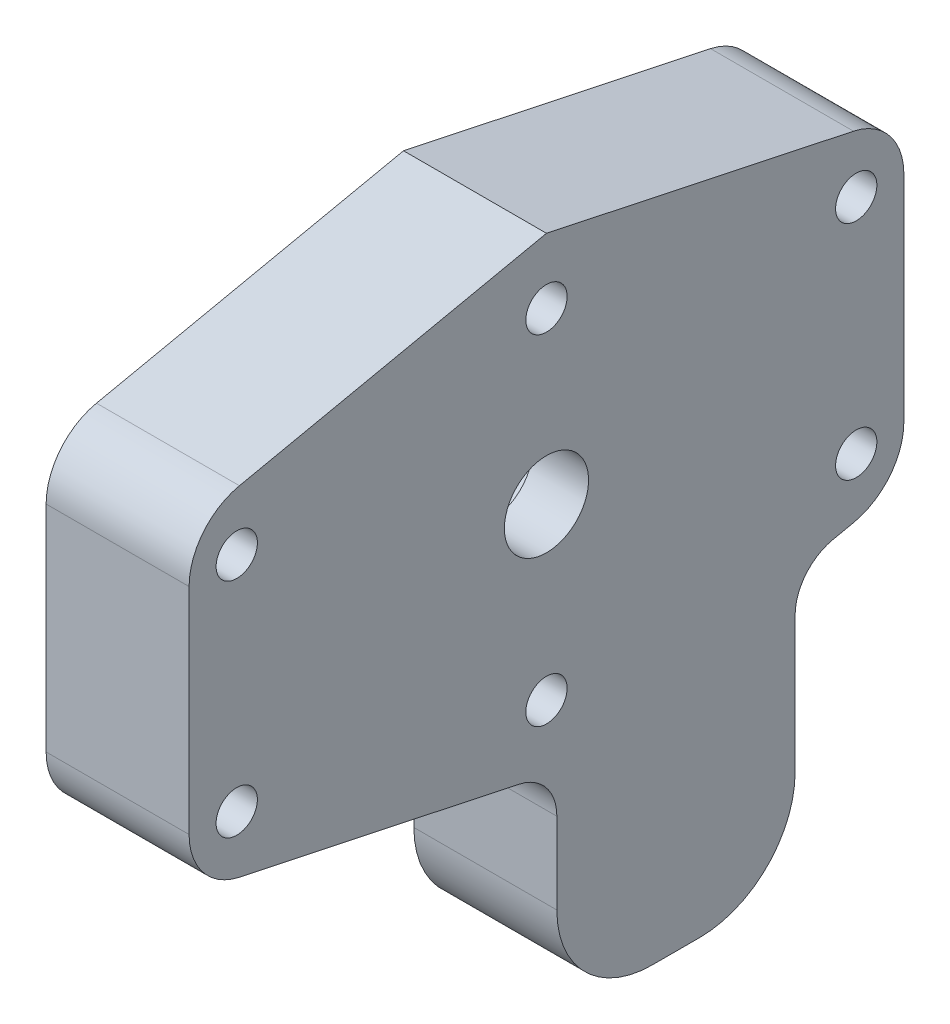
ISO-10303-21;
HEADER;
FILE_DESCRIPTION(('STEP AP214'),'2;1');
FILE_NAME('part.step','',(''),(''),'','','');
FILE_SCHEMA(('AUTOMOTIVE_DESIGN { 1 0 10303 214 1 1 1 1 }'));
ENDSEC;
DATA;
#1=APPLICATION_CONTEXT('core data for automotive mechanical design processes');
#2=APPLICATION_PROTOCOL_DEFINITION('international standard','automotive_design',2000,#1);
#3=PRODUCT_CONTEXT('',#1,'mechanical');
#4=PRODUCT('Part','Part','',(#3));
#5=PRODUCT_RELATED_PRODUCT_CATEGORY('part','',(#4));
#6=PRODUCT_DEFINITION_FORMATION('','',#4);
#7=PRODUCT_DEFINITION_CONTEXT('part definition',#1,'design');
#8=PRODUCT_DEFINITION('design','',#6,#7);
#9=PRODUCT_DEFINITION_SHAPE('','',#8);
#10=(LENGTH_UNIT() NAMED_UNIT(*) SI_UNIT(.MILLI.,.METRE.));
#11=(NAMED_UNIT(*) PLANE_ANGLE_UNIT() SI_UNIT($,.RADIAN.));
#12=(NAMED_UNIT(*) SI_UNIT($,.STERADIAN.) SOLID_ANGLE_UNIT());
#13=UNCERTAINTY_MEASURE_WITH_UNIT(LENGTH_MEASURE(1.E-05),#10,'distance_accuracy_value','');
#14=(GEOMETRIC_REPRESENTATION_CONTEXT(3) GLOBAL_UNCERTAINTY_ASSIGNED_CONTEXT((#13)) GLOBAL_UNIT_ASSIGNED_CONTEXT((#10,
#11,#12)) REPRESENTATION_CONTEXT('',''));
#15=CARTESIAN_POINT('',(0.,0.,0.));
#16=DIRECTION('',(0.,0.,1.));
#17=DIRECTION('',(1.,0.,0.));
#18=AXIS2_PLACEMENT_3D('',#15,#16,#17);
#19=CARTESIAN_POINT('',(9.,-28.2690306373786,-5.99265255801159));
#20=DIRECTION('',(0.,0.978260869565217,0.207378087264553));
#21=DIRECTION('',(0.,-0.207378087264554,0.978260869565218));
#22=AXIS2_PLACEMENT_3D('',#19,#20,#21);
#23=PLANE('',#22);
#24=DIRECTION('',(0.,0.207378087264554,-0.978260869565218));
#25=VECTOR('',#24,1.);
#26=CARTESIAN_POINT('',(9.,-28.2690306373786,-5.99265255801159));
#27=LINE('',#26,#25);
#28=CARTESIAN_POINT('',(9.,-20.9475712012116,-40.5300396512498));
#29=VERTEX_POINT('',#28);
#30=CARTESIAN_POINT('',(9.,-20.672100546187,-41.8295123490582));
#31=VERTEX_POINT('',#30);
#32=EDGE_CURVE('E195',#29,#31,#27,.T.);
#33=ORIENTED_EDGE('',*,*,#32,.F.);
#34=DIRECTION('',(1.,0.,0.));
#35=VECTOR('',#34,1.);
#36=CARTESIAN_POINT('',(9.,-20.9475712012116,-40.5300396512498));
#37=LINE('',#36,#35);
#38=CARTESIAN_POINT('',(0.,-20.9475712012116,-40.5300396512498));
#39=VERTEX_POINT('',#38);
#40=EDGE_CURVE('E299',#29,#39,#37,.F.);
#41=ORIENTED_EDGE('',*,*,#40,.T.);
#42=DIRECTION('',(0.,0.207378087264554,-0.978260869565218));
#43=VECTOR('',#42,1.);
#44=CARTESIAN_POINT('',(0.,-28.2690306373786,-5.99265255801159));
#45=LINE('',#44,#43);
#46=CARTESIAN_POINT('',(0.,-20.672100546187,-41.8295123490582));
#47=VERTEX_POINT('',#46);
#48=EDGE_CURVE('E226',#39,#47,#45,.T.);
#49=ORIENTED_EDGE('',*,*,#48,.T.);
#50=DIRECTION('',(-1.,0.,0.));
#51=VECTOR('',#50,1.);
#52=CARTESIAN_POINT('',(9.,-20.672100546187,-41.8295123490582));
#53=LINE('',#52,#51);
#54=EDGE_CURVE('E275',#47,#31,#53,.F.);
#55=ORIENTED_EDGE('',*,*,#54,.T.);
#56=EDGE_LOOP('',(#33,#41,#49,#55));
#57=FACE_BOUND('',#56,.T.);
#58=ADVANCED_FACE('F35',(#57),#23,.F.);
#59=CARTESIAN_POINT('',(9.,0.,-45.));
#60=DIRECTION('',(0.,0.,-1.));
#61=DIRECTION('',(-1.,0.,0.));
#62=AXIS2_PLACEMENT_3D('',#59,#60,#61);
#63=PLANE('',#62);
#64=DIRECTION('',(0.,-1.,0.));
#65=VECTOR('',#64,1.);
#66=CARTESIAN_POINT('',(9.,0.,-45.));
#67=LINE('',#66,#65);
#68=CARTESIAN_POINT('',(9.,-3.24094293207383,-45.));
#69=VERTEX_POINT('',#68);
#70=CARTESIAN_POINT('',(9.,-16.7590570679262,-45.));
#71=VERTEX_POINT('',#70);
#72=EDGE_CURVE('E184',#69,#71,#67,.T.);
#73=ORIENTED_EDGE('',*,*,#72,.T.);
#74=DIRECTION('',(-1.,0.,0.));
#75=VECTOR('',#74,1.);
#76=CARTESIAN_POINT('',(0.,-16.7590570679262,-45.));
#77=LINE('',#76,#75);
#78=CARTESIAN_POINT('',(0.,-16.7590570679262,-45.));
#79=VERTEX_POINT('',#78);
#80=EDGE_CURVE('E263',#71,#79,#77,.T.);
#81=ORIENTED_EDGE('',*,*,#80,.T.);
#82=DIRECTION('',(0.,-1.,0.));
#83=VECTOR('',#82,1.);
#84=CARTESIAN_POINT('',(0.,0.,-45.));
#85=LINE('',#84,#83);
#86=CARTESIAN_POINT('',(0.,-3.24094293207383,-45.));
#87=VERTEX_POINT('',#86);
#88=EDGE_CURVE('E214',#87,#79,#85,.T.);
#89=ORIENTED_EDGE('',*,*,#88,.F.);
#90=DIRECTION('',(-1.,0.,0.));
#91=VECTOR('',#90,1.);
#92=CARTESIAN_POINT('',(9.,-3.24094293207383,-45.));
#93=LINE('',#92,#91);
#94=EDGE_CURVE('E261',#87,#69,#93,.F.);
#95=ORIENTED_EDGE('',*,*,#94,.T.);
#96=EDGE_LOOP('',(#73,#81,#89,#95));
#97=FACE_BOUND('',#96,.T.);
#98=ADVANCED_FACE('F374',(#97),#63,.T.);
#99=CARTESIAN_POINT('',(9.,9.12914405892871,-1.93525519848772));
#100=DIRECTION('',(0.,0.978260869565217,-0.207378087264554));
#101=DIRECTION('',(0.,0.207378087264554,0.978260869565218));
#102=AXIS2_PLACEMENT_3D('',#99,#100,#101);
#103=PLANE('',#102);
#104=DIRECTION('',(0.,-0.207378087264554,-0.978260869565218));
#105=VECTOR('',#104,1.);
#106=CARTESIAN_POINT('',(9.,9.12914405892871,-1.93525519848772));
#107=LINE('',#106,#105);
#108=CARTESIAN_POINT('',(9.,4.76969600708473,-22.5));
#109=VERTEX_POINT('',#108);
#110=CARTESIAN_POINT('',(9.,0.672100546187042,-41.8295123490582));
#111=VERTEX_POINT('',#110);
#112=EDGE_CURVE('E159',#109,#111,#107,.T.);
#113=ORIENTED_EDGE('',*,*,#112,.T.);
#114=DIRECTION('',(-1.,0.,0.));
#115=VECTOR('',#114,1.);
#116=CARTESIAN_POINT('',(9.,0.672100546187042,-41.8295123490582));
#117=LINE('',#116,#115);
#118=CARTESIAN_POINT('',(0.,0.672100546187042,-41.8295123490582));
#119=VERTEX_POINT('',#118);
#120=EDGE_CURVE('E285',#111,#119,#117,.T.);
#121=ORIENTED_EDGE('',*,*,#120,.T.);
#122=DIRECTION('',(0.,-0.207378087264554,-0.978260869565218));
#123=VECTOR('',#122,1.);
#124=CARTESIAN_POINT('',(0.,9.12914405892871,-1.93525519848772));
#125=LINE('',#124,#123);
#126=CARTESIAN_POINT('',(0.,4.76969600708473,-22.5));
#127=VERTEX_POINT('',#126);
#128=EDGE_CURVE('E162',#127,#119,#125,.T.);
#129=ORIENTED_EDGE('',*,*,#128,.F.);
#130=DIRECTION('',(-1.,0.,0.));
#131=VECTOR('',#130,1.);
#132=CARTESIAN_POINT('',(9.,4.76969600708473,-22.5));
#133=LINE('',#132,#131);
#134=EDGE_CURVE('E154',#109,#127,#133,.T.);
#135=ORIENTED_EDGE('',*,*,#134,.F.);
#136=EDGE_LOOP('',(#113,#121,#129,#135));
#137=FACE_BOUND('',#136,.T.);
#138=ADVANCED_FACE('F156',(#137),#103,.T.);
#139=CARTESIAN_POINT('',(9.,0.,0.));
#140=DIRECTION('',(0.,-0.978260869565217,-0.207378087264554));
#141=DIRECTION('',(0.,0.207378087264554,-0.978260869565218));
#142=AXIS2_PLACEMENT_3D('',#139,#140,#141);
#143=PLANE('',#142);
#144=DIRECTION('',(0.,-0.207378087264554,0.978260869565218));
#145=VECTOR('',#144,1.);
#146=CARTESIAN_POINT('',(0.,0.,0.));
#147=LINE('',#146,#145);
#148=CARTESIAN_POINT('',(0.,0.672100546187044,-3.17048765094179));
#149=VERTEX_POINT('',#148);
#150=EDGE_CURVE('E219',#127,#149,#147,.T.);
#151=ORIENTED_EDGE('',*,*,#150,.T.);
#152=DIRECTION('',(-1.,0.,0.));
#153=VECTOR('',#152,1.);
#154=CARTESIAN_POINT('',(9.,0.672100546187044,-3.17048765094179));
#155=LINE('',#154,#153);
#156=CARTESIAN_POINT('',(9.,0.672100546187044,-3.17048765094179));
#157=VERTEX_POINT('',#156);
#158=EDGE_CURVE('E173',#149,#157,#155,.F.);
#159=ORIENTED_EDGE('',*,*,#158,.T.);
#160=DIRECTION('',(0.,-0.207378087264554,0.978260869565218));
#161=VECTOR('',#160,1.);
#162=CARTESIAN_POINT('',(9.,0.,0.));
#163=LINE('',#162,#161);
#164=EDGE_CURVE('E170',#109,#157,#163,.T.);
#165=ORIENTED_EDGE('',*,*,#164,.F.);
#166=ORIENTED_EDGE('',*,*,#134,.T.);
#167=EDGE_LOOP('',(#151,#159,#165,#166));
#168=FACE_BOUND('',#167,.T.);
#169=ADVANCED_FACE('F171',(#168),#143,.F.);
#170=CARTESIAN_POINT('',(9.,0.,0.));
#171=DIRECTION('',(0.,0.,-1.));
#172=DIRECTION('',(0.,1.,0.));
#173=AXIS2_PLACEMENT_3D('',#170,#171,#172);
#174=PLANE('',#173);
#175=DIRECTION('',(0.,-1.,0.));
#176=VECTOR('',#175,1.);
#177=CARTESIAN_POINT('',(9.,0.,0.));
#178=LINE('',#177,#176);
#179=CARTESIAN_POINT('',(9.,-3.24094293207383,0.));
#180=VERTEX_POINT('',#179);
#181=CARTESIAN_POINT('',(9.,-16.7590570679262,0.));
#182=VERTEX_POINT('',#181);
#183=EDGE_CURVE('E176',#180,#182,#178,.T.);
#184=ORIENTED_EDGE('',*,*,#183,.F.);
#185=DIRECTION('',(-1.,0.,0.));
#186=VECTOR('',#185,1.);
#187=CARTESIAN_POINT('',(9.,-3.24094293207383,0.));
#188=LINE('',#187,#186);
#189=CARTESIAN_POINT('',(0.,-3.24094293207383,0.));
#190=VERTEX_POINT('',#189);
#191=EDGE_CURVE('E289',#180,#190,#188,.T.);
#192=ORIENTED_EDGE('',*,*,#191,.T.);
#193=DIRECTION('',(0.,-1.,0.));
#194=VECTOR('',#193,1.);
#195=CARTESIAN_POINT('',(0.,0.,0.));
#196=LINE('',#195,#194);
#197=CARTESIAN_POINT('',(0.,-16.7590570679262,0.));
#198=VERTEX_POINT('',#197);
#199=EDGE_CURVE('E221',#190,#198,#196,.T.);
#200=ORIENTED_EDGE('',*,*,#199,.T.);
#201=DIRECTION('',(-1.,0.,0.));
#202=VECTOR('',#201,1.);
#203=CARTESIAN_POINT('',(9.,-16.7590570679262,0.));
#204=LINE('',#203,#202);
#205=EDGE_CURVE('E287',#198,#182,#204,.F.);
#206=ORIENTED_EDGE('',*,*,#205,.T.);
#207=EDGE_LOOP('',(#184,#192,#200,#206));
#208=FACE_BOUND('',#207,.T.);
#209=ADVANCED_FACE('F391',(#208),#174,.F.);
#210=CARTESIAN_POINT('',(9.,-19.1398865784499,4.05739735952387));
#211=DIRECTION('',(0.,0.978260869565217,-0.207378087264553));
#212=DIRECTION('',(0.,0.207378087264554,0.978260869565218));
#213=AXIS2_PLACEMENT_3D('',#210,#211,#212);
#214=PLANE('',#213);
#215=DIRECTION('',(0.,-0.207378087264554,-0.978260869565218));
#216=VECTOR('',#215,1.);
#217=CARTESIAN_POINT('',(0.,-19.1398865784499,4.05739735952387));
#218=LINE('',#217,#216);
#219=CARTESIAN_POINT('',(0.,-20.672100546187,-3.17048765094179));
#220=VERTEX_POINT('',#219);
#221=CARTESIAN_POINT('',(0.,-24.4038726556208,-20.7743081748371));
#222=VERTEX_POINT('',#221);
#223=EDGE_CURVE('E224',#220,#222,#218,.T.);
#224=ORIENTED_EDGE('',*,*,#223,.T.);
#225=DIRECTION('',(-1.,0.,0.));
#226=VECTOR('',#225,1.);
#227=CARTESIAN_POINT('',(9.,-24.4038726556208,-20.7743081748371));
#228=LINE('',#227,#226);
#229=CARTESIAN_POINT('',(9.,-24.4038726556208,-20.7743081748371));
#230=VERTEX_POINT('',#229);
#231=EDGE_CURVE('E56',#222,#230,#228,.F.);
#232=ORIENTED_EDGE('',*,*,#231,.T.);
#233=DIRECTION('',(0.,-0.207378087264554,-0.978260869565218));
#234=VECTOR('',#233,1.);
#235=CARTESIAN_POINT('',(9.,-19.1398865784499,4.05739735952387));
#236=LINE('',#235,#234);
#237=CARTESIAN_POINT('',(9.,-20.672100546187,-3.17048765094179));
#238=VERTEX_POINT('',#237);
#239=EDGE_CURVE('E193',#238,#230,#236,.T.);
#240=ORIENTED_EDGE('',*,*,#239,.F.);
#241=DIRECTION('',(-1.,0.,0.));
#242=VECTOR('',#241,1.);
#243=CARTESIAN_POINT('',(9.,-20.672100546187,-3.17048765094179));
#244=LINE('',#243,#242);
#245=EDGE_CURVE('E293',#238,#220,#244,.T.);
#246=ORIENTED_EDGE('',*,*,#245,.T.);
#247=EDGE_LOOP('',(#224,#232,#240,#246));
#248=FACE_BOUND('',#247,.T.);
#249=ADVANCED_FACE('F387',(#248),#214,.F.);
#250=CARTESIAN_POINT('',(9.,-17.0000000000008,-3.));
#251=DIRECTION('',(-1.,0.,0.));
#252=DIRECTION('',(0.,0.,1.));
#253=AXIS2_PLACEMENT_3D('',#250,#251,#252);
#254=CYLINDRICAL_SURFACE('',#253,1.3);
#255=CARTESIAN_POINT('',(9.,-17.0000000000008,-3.));
#256=DIRECTION('',(1.,0.,0.));
#257=DIRECTION('',(0.,0.,-1.));
#258=AXIS2_PLACEMENT_3D('',#255,#256,#257);
#259=CIRCLE('',#258,1.3);
#260=CARTESIAN_POINT('',(9.,-17.0000000000008,-4.3));
#261=VERTEX_POINT('',#260);
#262=EDGE_CURVE('E206',#261,#261,#259,.T.);
#263=ORIENTED_EDGE('',*,*,#262,.T.);
#264=EDGE_LOOP('',(#263));
#265=FACE_BOUND('',#264,.T.);
#266=CARTESIAN_POINT('',(0.,-17.0000000000008,-3.));
#267=DIRECTION('',(1.,0.,0.));
#268=DIRECTION('',(0.,0.,-1.));
#269=AXIS2_PLACEMENT_3D('',#266,#267,#268);
#270=CIRCLE('',#269,1.3);
#271=CARTESIAN_POINT('',(0.,-17.0000000000008,-4.3));
#272=VERTEX_POINT('',#271);
#273=EDGE_CURVE('E237',#272,#272,#270,.T.);
#274=ORIENTED_EDGE('',*,*,#273,.F.);
#275=EDGE_LOOP('',(#274));
#276=FACE_BOUND('',#275,.T.);
#277=ADVANCED_FACE('F390',(#265,#276),#254,.F.);
#278=CARTESIAN_POINT('',(9.,-3.00000000000081,-2.99999999999995));
#279=DIRECTION('',(-1.,0.,0.));
#280=DIRECTION('',(0.,0.,1.));
#281=AXIS2_PLACEMENT_3D('',#278,#279,#280);
#282=CYLINDRICAL_SURFACE('',#281,1.3);
#283=CARTESIAN_POINT('',(9.,-3.00000000000081,-2.99999999999995));
#284=DIRECTION('',(1.,0.,0.));
#285=DIRECTION('',(0.,0.,-1.));
#286=AXIS2_PLACEMENT_3D('',#283,#284,#285);
#287=CIRCLE('',#286,1.3);
#288=CARTESIAN_POINT('',(9.,-3.00000000000081,-4.29999999999995));
#289=VERTEX_POINT('',#288);
#290=EDGE_CURVE('E203',#289,#289,#287,.T.);
#291=ORIENTED_EDGE('',*,*,#290,.T.);
#292=EDGE_LOOP('',(#291));
#293=FACE_BOUND('',#292,.T.);
#294=CARTESIAN_POINT('',(0.,-3.00000000000081,-2.99999999999995));
#295=DIRECTION('',(1.,0.,0.));
#296=DIRECTION('',(0.,0.,-1.));
#297=AXIS2_PLACEMENT_3D('',#294,#295,#296);
#298=CIRCLE('',#297,1.3);
#299=CARTESIAN_POINT('',(0.,-3.00000000000081,-4.29999999999995));
#300=VERTEX_POINT('',#299);
#301=EDGE_CURVE('E234',#300,#300,#298,.T.);
#302=ORIENTED_EDGE('',*,*,#301,.F.);
#303=EDGE_LOOP('',(#302));
#304=FACE_BOUND('',#303,.T.);
#305=ADVANCED_FACE('F684',(#293,#304),#282,.F.);
#306=CARTESIAN_POINT('',(9.,-3.,-42.));
#307=DIRECTION('',(-1.,0.,0.));
#308=DIRECTION('',(0.,0.,1.));
#309=AXIS2_PLACEMENT_3D('',#306,#307,#308);
#310=CYLINDRICAL_SURFACE('',#309,1.3);
#311=CARTESIAN_POINT('',(9.,-3.,-42.));
#312=DIRECTION('',(1.,0.,0.));
#313=DIRECTION('',(0.,0.,-1.));
#314=AXIS2_PLACEMENT_3D('',#311,#312,#313);
#315=CIRCLE('',#314,1.3);
#316=CARTESIAN_POINT('',(9.,-3.,-43.2999999999999));
#317=VERTEX_POINT('',#316);
#318=EDGE_CURVE('E200',#317,#317,#315,.T.);
#319=ORIENTED_EDGE('',*,*,#318,.T.);
#320=EDGE_LOOP('',(#319));
#321=FACE_BOUND('',#320,.T.);
#322=CARTESIAN_POINT('',(0.,-3.,-42.));
#323=DIRECTION('',(1.,0.,0.));
#324=DIRECTION('',(0.,0.,-1.));
#325=AXIS2_PLACEMENT_3D('',#322,#323,#324);
#326=CIRCLE('',#325,1.3);
#327=CARTESIAN_POINT('',(0.,-3.,-43.2999999999999));
#328=VERTEX_POINT('',#327);
#329=EDGE_CURVE('E231',#328,#328,#326,.T.);
#330=ORIENTED_EDGE('',*,*,#329,.F.);
#331=EDGE_LOOP('',(#330));
#332=FACE_BOUND('',#331,.T.);
#333=ADVANCED_FACE('F676',(#321,#332),#310,.F.);
#334=CARTESIAN_POINT('',(9.,0.680807118195843,-22.5));
#335=DIRECTION('',(-1.,0.,0.));
#336=DIRECTION('',(0.,0.,1.));
#337=AXIS2_PLACEMENT_3D('',#334,#335,#336);
#338=CYLINDRICAL_SURFACE('',#337,1.3);
#339=CARTESIAN_POINT('',(9.,0.680807118195843,-22.5));
#340=DIRECTION('',(1.,0.,0.));
#341=DIRECTION('',(0.,0.,-1.));
#342=AXIS2_PLACEMENT_3D('',#339,#340,#341);
#343=CIRCLE('',#342,1.3);
#344=CARTESIAN_POINT('',(9.,0.680807118195843,-23.8));
#345=VERTEX_POINT('',#344);
#346=EDGE_CURVE('E197',#345,#345,#343,.T.);
#347=ORIENTED_EDGE('',*,*,#346,.T.);
#348=EDGE_LOOP('',(#347));
#349=FACE_BOUND('',#348,.T.);
#350=CARTESIAN_POINT('',(0.,0.680807118195843,-22.5));
#351=DIRECTION('',(1.,0.,0.));
#352=DIRECTION('',(0.,0.,-1.));
#353=AXIS2_PLACEMENT_3D('',#350,#351,#352);
#354=CIRCLE('',#353,1.3);
#355=CARTESIAN_POINT('',(0.,0.680807118195843,-23.8));
#356=VERTEX_POINT('',#355);
#357=EDGE_CURVE('E228',#356,#356,#354,.T.);
#358=ORIENTED_EDGE('',*,*,#357,.F.);
#359=EDGE_LOOP('',(#358));
#360=FACE_BOUND('',#359,.T.);
#361=ADVANCED_FACE('F385',(#349,#360),#338,.F.);
#362=CARTESIAN_POINT('',(9.,-20.6808071181958,-22.5));
#363=DIRECTION('',(-1.,0.,0.));
#364=DIRECTION('',(0.,0.,1.));
#365=AXIS2_PLACEMENT_3D('',#362,#363,#364);
#366=CYLINDRICAL_SURFACE('',#365,1.3);
#367=CARTESIAN_POINT('',(9.,-20.6808071181958,-22.5));
#368=DIRECTION('',(1.,0.,0.));
#369=DIRECTION('',(0.,0.,-1.));
#370=AXIS2_PLACEMENT_3D('',#367,#368,#369);
#371=CIRCLE('',#370,1.3);
#372=CARTESIAN_POINT('',(9.,-20.6808071181958,-23.8));
#373=VERTEX_POINT('',#372);
#374=EDGE_CURVE('E187',#373,#373,#371,.T.);
#375=ORIENTED_EDGE('',*,*,#374,.T.);
#376=EDGE_LOOP('',(#375));
#377=FACE_BOUND('',#376,.T.);
#378=CARTESIAN_POINT('',(0.,-20.6808071181958,-22.5));
#379=DIRECTION('',(1.,0.,0.));
#380=DIRECTION('',(0.,0.,-1.));
#381=AXIS2_PLACEMENT_3D('',#378,#379,#380);
#382=CIRCLE('',#381,1.3);
#383=CARTESIAN_POINT('',(0.,-20.6808071181958,-23.8));
#384=VERTEX_POINT('',#383);
#385=EDGE_CURVE('E211',#384,#384,#382,.T.);
#386=ORIENTED_EDGE('',*,*,#385,.F.);
#387=EDGE_LOOP('',(#386));
#388=FACE_BOUND('',#387,.T.);
#389=ADVANCED_FACE('F356',(#377,#388),#366,.F.);
#390=CARTESIAN_POINT('',(9.,-17.,-42.));
#391=DIRECTION('',(-1.,0.,0.));
#392=DIRECTION('',(0.,0.,1.));
#393=AXIS2_PLACEMENT_3D('',#390,#391,#392);
#394=CYLINDRICAL_SURFACE('',#393,1.3);
#395=CARTESIAN_POINT('',(9.,-17.,-42.));
#396=DIRECTION('',(1.,0.,0.));
#397=DIRECTION('',(0.,0.,-1.));
#398=AXIS2_PLACEMENT_3D('',#395,#396,#397);
#399=CIRCLE('',#398,1.3);
#400=CARTESIAN_POINT('',(9.,-17.,-43.3));
#401=VERTEX_POINT('',#400);
#402=EDGE_CURVE('E167',#401,#401,#399,.T.);
#403=ORIENTED_EDGE('',*,*,#402,.T.);
#404=EDGE_LOOP('',(#403));
#405=FACE_BOUND('',#404,.T.);
#406=CARTESIAN_POINT('',(0.,-17.,-42.));
#407=DIRECTION('',(1.,0.,0.));
#408=DIRECTION('',(0.,0.,-1.));
#409=AXIS2_PLACEMENT_3D('',#406,#407,#408);
#410=CIRCLE('',#409,1.3);
#411=CARTESIAN_POINT('',(0.,-17.,-43.3));
#412=VERTEX_POINT('',#411);
#413=EDGE_CURVE('E240',#412,#412,#410,.T.);
#414=ORIENTED_EDGE('',*,*,#413,.F.);
#415=EDGE_LOOP('',(#414));
#416=FACE_BOUND('',#415,.T.);
#417=ADVANCED_FACE('F360',(#405,#416),#394,.F.);
#418=CARTESIAN_POINT('',(9.,0.,0.));
#419=DIRECTION('',(1.,0.,0.));
#420=DIRECTION('',(0.,0.,-1.));
#421=AXIS2_PLACEMENT_3D('',#418,#419,#420);
#422=PLANE('',#421);
#423=CARTESIAN_POINT('',(9.,-10.,-22.5));
#424=DIRECTION('',(-1.,0.,0.));
#425=DIRECTION('',(0.,0.,1.));
#426=AXIS2_PLACEMENT_3D('',#423,#424,#425);
#427=CIRCLE('',#426,2.65);
#428=CARTESIAN_POINT('',(9.,-10.,-19.85));
#429=VERTEX_POINT('',#428);
#430=EDGE_CURVE('E338',#429,#429,#427,.T.);
#431=ORIENTED_EDGE('',*,*,#430,.T.);
#432=EDGE_LOOP('',(#431));
#433=FACE_BOUND('',#432,.T.);
#434=ORIENTED_EDGE('',*,*,#374,.F.);
#435=EDGE_LOOP('',(#434));
#436=FACE_BOUND('',#435,.T.);
#437=DIRECTION('',(0.,1.,0.));
#438=VECTOR('',#437,1.);
#439=CARTESIAN_POINT('',(9.,-21.4516466108519,-38.1521739130435));
#440=LINE('',#439,#438);
#441=CARTESIAN_POINT('',(9.,-32.4516466108519,-38.1521739130435));
#442=VERTEX_POINT('',#441);
#443=CARTESIAN_POINT('',(9.,-23.8823538099072,-38.1521739130435));
#444=VERTEX_POINT('',#443);
#445=EDGE_CURVE('E322',#442,#444,#440,.T.);
#446=ORIENTED_EDGE('',*,*,#445,.T.);
#447=CARTESIAN_POINT('',(9.,-23.8823538099072,-41.1521739130435));
#448=DIRECTION('',(1.,0.,0.));
#449=DIRECTION('',(0.,0.,-1.));
#450=AXIS2_PLACEMENT_3D('',#447,#448,#449);
#451=CIRCLE('',#450,3.);
#452=EDGE_CURVE('E301',#444,#29,#451,.F.);
#453=ORIENTED_EDGE('',*,*,#452,.T.);
#454=ORIENTED_EDGE('',*,*,#32,.T.);
#455=CARTESIAN_POINT('',(9.,-16.7590570679262,-41.));
#456=DIRECTION('',(1.,0.,0.));
#457=DIRECTION('',(0.,0.,-1.));
#458=AXIS2_PLACEMENT_3D('',#455,#456,#457);
#459=CIRCLE('',#458,4.);
#460=EDGE_CURVE('E283',#31,#71,#459,.T.);
#461=ORIENTED_EDGE('',*,*,#460,.T.);
#462=ORIENTED_EDGE('',*,*,#72,.F.);
#463=CARTESIAN_POINT('',(9.,-3.24094293207383,-41.));
#464=DIRECTION('',(1.,0.,0.));
#465=DIRECTION('',(0.,0.,-1.));
#466=AXIS2_PLACEMENT_3D('',#463,#464,#465);
#467=CIRCLE('',#466,4.);
#468=EDGE_CURVE('E183',#69,#111,#467,.T.);
#469=ORIENTED_EDGE('',*,*,#468,.T.);
#470=ORIENTED_EDGE('',*,*,#112,.F.);
#471=ORIENTED_EDGE('',*,*,#164,.T.);
#472=CARTESIAN_POINT('',(9.,-3.24094293207383,-4.));
#473=DIRECTION('',(1.,0.,0.));
#474=DIRECTION('',(0.,0.,-1.));
#475=AXIS2_PLACEMENT_3D('',#472,#473,#474);
#476=CIRCLE('',#475,4.);
#477=EDGE_CURVE('E280',#157,#180,#476,.T.);
#478=ORIENTED_EDGE('',*,*,#477,.T.);
#479=ORIENTED_EDGE('',*,*,#183,.T.);
#480=CARTESIAN_POINT('',(9.,-16.7590570679262,-4.));
#481=DIRECTION('',(1.,0.,0.));
#482=DIRECTION('',(0.,0.,-1.));
#483=AXIS2_PLACEMENT_3D('',#480,#481,#482);
#484=CIRCLE('',#483,4.);
#485=EDGE_CURVE('E278',#182,#238,#484,.T.);
#486=ORIENTED_EDGE('',*,*,#485,.T.);
#487=ORIENTED_EDGE('',*,*,#239,.T.);
#488=CARTESIAN_POINT('',(9.,-27.3386552643165,-20.1521739130435));
#489=DIRECTION('',(1.,0.,0.));
#490=DIRECTION('',(0.,0.,-1.));
#491=AXIS2_PLACEMENT_3D('',#488,#489,#490);
#492=CIRCLE('',#491,3.);
#493=CARTESIAN_POINT('',(9.,-27.3386552643165,-23.1521739130435));
#494=VERTEX_POINT('',#493);
#495=EDGE_CURVE('E11',#230,#494,#492,.F.);
#496=ORIENTED_EDGE('',*,*,#495,.T.);
#497=DIRECTION('',(0.,-1.,0.));
#498=VECTOR('',#497,1.);
#499=CARTESIAN_POINT('',(9.,-38.4516466108519,-23.1521739130435));
#500=LINE('',#499,#498);
#501=CARTESIAN_POINT('',(9.,-32.4516466108519,-23.1521739130435));
#502=VERTEX_POINT('',#501);
#503=EDGE_CURVE('E313',#494,#502,#500,.T.);
#504=ORIENTED_EDGE('',*,*,#503,.T.);
#505=CARTESIAN_POINT('',(9.,-32.4516466108519,-29.1521739130435));
#506=DIRECTION('',(1.,0.,0.));
#507=DIRECTION('',(0.,0.,-1.));
#508=AXIS2_PLACEMENT_3D('',#505,#506,#507);
#509=CIRCLE('',#508,6.);
#510=CARTESIAN_POINT('',(9.,-38.4516466108519,-29.1521739130435));
#511=VERTEX_POINT('',#510);
#512=EDGE_CURVE('E247',#502,#511,#509,.T.);
#513=ORIENTED_EDGE('',*,*,#512,.T.);
#514=DIRECTION('',(0.,0.,-1.));
#515=VECTOR('',#514,1.);
#516=CARTESIAN_POINT('',(9.,-38.4516466108519,-38.1521739130435));
#517=LINE('',#516,#515);
#518=CARTESIAN_POINT('',(9.,-38.4516466108519,-32.1521739130435));
#519=VERTEX_POINT('',#518);
#520=EDGE_CURVE('E327',#511,#519,#517,.T.);
#521=ORIENTED_EDGE('',*,*,#520,.T.);
#522=CARTESIAN_POINT('',(9.,-32.4516466108519,-32.1521739130435));
#523=DIRECTION('',(1.,0.,0.));
#524=DIRECTION('',(0.,0.,-1.));
#525=AXIS2_PLACEMENT_3D('',#522,#523,#524);
#526=CIRCLE('',#525,6.);
#527=EDGE_CURVE('E245',#519,#442,#526,.T.);
#528=ORIENTED_EDGE('',*,*,#527,.T.);
#529=EDGE_LOOP('',(#446,#453,#454,#461,#462,#469,#470,#471,#478,#479,#486,#487,#496,#504,#513,
#521,#528));
#530=FACE_BOUND('',#529,.T.);
#531=ORIENTED_EDGE('',*,*,#346,.F.);
#532=EDGE_LOOP('',(#531));
#533=FACE_BOUND('',#532,.T.);
#534=ORIENTED_EDGE('',*,*,#318,.F.);
#535=EDGE_LOOP('',(#534));
#536=FACE_BOUND('',#535,.T.);
#537=ORIENTED_EDGE('',*,*,#290,.F.);
#538=EDGE_LOOP('',(#537));
#539=FACE_BOUND('',#538,.T.);
#540=ORIENTED_EDGE('',*,*,#262,.F.);
#541=EDGE_LOOP('',(#540));
#542=FACE_BOUND('',#541,.T.);
#543=ORIENTED_EDGE('',*,*,#402,.F.);
#544=EDGE_LOOP('',(#543));
#545=FACE_BOUND('',#544,.T.);
#546=ADVANCED_FACE('F179',(#433,#436,#530,#533,#536,#539,#542,#545),#422,.T.);
#547=CARTESIAN_POINT('',(0.,0.,0.));
#548=DIRECTION('',(1.,0.,0.));
#549=DIRECTION('',(0.,0.,-1.));
#550=AXIS2_PLACEMENT_3D('',#547,#548,#549);
#551=PLANE('',#550);
#552=CARTESIAN_POINT('',(0.,-30.4516466108519,-30.6521739130435));
#553=DIRECTION('',(1.,0.,0.));
#554=DIRECTION('',(0.,0.,1.));
#555=AXIS2_PLACEMENT_3D('',#552,#553,#554);
#556=CIRCLE('',#555,5.2);
#557=CARTESIAN_POINT('',(0.,-30.4516466108519,-25.4521739130435));
#558=VERTEX_POINT('',#557);
#559=EDGE_CURVE('E330',#558,#558,#556,.T.);
#560=ORIENTED_EDGE('',*,*,#559,.T.);
#561=EDGE_LOOP('',(#560));
#562=FACE_BOUND('',#561,.T.);
#563=CARTESIAN_POINT('',(0.,-10.,-22.5));
#564=DIRECTION('',(-1.,0.,0.));
#565=DIRECTION('',(0.,0.,1.));
#566=AXIS2_PLACEMENT_3D('',#563,#564,#565);
#567=CIRCLE('',#566,7.6);
#568=CARTESIAN_POINT('',(0.,-10.,-14.9));
#569=VERTEX_POINT('',#568);
#570=EDGE_CURVE('E341',#569,#569,#567,.T.);
#571=ORIENTED_EDGE('',*,*,#570,.F.);
#572=EDGE_LOOP('',(#571));
#573=FACE_BOUND('',#572,.T.);
#574=CARTESIAN_POINT('',(0.,-10.,-8.5));
#575=DIRECTION('',(1.,0.,0.));
#576=DIRECTION('',(0.,0.,1.));
#577=AXIS2_PLACEMENT_3D('',#574,#575,#576);
#578=CIRCLE('',#577,5.2);
#579=CARTESIAN_POINT('',(0.,-10.,-3.29999999999999));
#580=VERTEX_POINT('',#579);
#581=EDGE_CURVE('E347',#580,#580,#578,.T.);
#582=ORIENTED_EDGE('',*,*,#581,.T.);
#583=EDGE_LOOP('',(#582));
#584=FACE_BOUND('',#583,.T.);
#585=CARTESIAN_POINT('',(0.,-10.,-36.5));
#586=DIRECTION('',(1.,0.,0.));
#587=DIRECTION('',(0.,0.,1.));
#588=AXIS2_PLACEMENT_3D('',#585,#586,#587);
#589=CIRCLE('',#588,5.2);
#590=CARTESIAN_POINT('',(0.,-10.,-31.3));
#591=VERTEX_POINT('',#590);
#592=EDGE_CURVE('E215',#591,#591,#589,.T.);
#593=ORIENTED_EDGE('',*,*,#592,.T.);
#594=EDGE_LOOP('',(#593));
#595=FACE_BOUND('',#594,.T.);
#596=ORIENTED_EDGE('',*,*,#385,.T.);
#597=EDGE_LOOP('',(#596));
#598=FACE_BOUND('',#597,.T.);
#599=ORIENTED_EDGE('',*,*,#88,.T.);
#600=CARTESIAN_POINT('',(0.,-16.7590570679262,-41.));
#601=DIRECTION('',(1.,0.,0.));
#602=DIRECTION('',(0.,0.,-1.));
#603=AXIS2_PLACEMENT_3D('',#600,#601,#602);
#604=CIRCLE('',#603,4.);
#605=EDGE_CURVE('E272',#79,#47,#604,.F.);
#606=ORIENTED_EDGE('',*,*,#605,.T.);
#607=ORIENTED_EDGE('',*,*,#48,.F.);
#608=CARTESIAN_POINT('',(0.,-23.8823538099072,-41.1521739130435));
#609=DIRECTION('',(1.,0.,0.));
#610=DIRECTION('',(0.,0.,-1.));
#611=AXIS2_PLACEMENT_3D('',#608,#609,#610);
#612=CIRCLE('',#611,3.);
#613=CARTESIAN_POINT('',(0.,-23.8823538099072,-38.1521739130435));
#614=VERTEX_POINT('',#613);
#615=EDGE_CURVE('E303',#39,#614,#612,.T.);
#616=ORIENTED_EDGE('',*,*,#615,.T.);
#617=DIRECTION('',(0.,1.,0.));
#618=VECTOR('',#617,1.);
#619=CARTESIAN_POINT('',(0.,-21.4516466108519,-38.1521739130435));
#620=LINE('',#619,#618);
#621=CARTESIAN_POINT('',(0.,-32.4516466108519,-38.1521739130435));
#622=VERTEX_POINT('',#621);
#623=EDGE_CURVE('E325',#622,#614,#620,.T.);
#624=ORIENTED_EDGE('',*,*,#623,.F.);
#625=CARTESIAN_POINT('',(0.,-32.4516466108519,-32.1521739130435));
#626=DIRECTION('',(1.,0.,0.));
#627=DIRECTION('',(0.,0.,-1.));
#628=AXIS2_PLACEMENT_3D('',#625,#626,#627);
#629=CIRCLE('',#628,6.);
#630=CARTESIAN_POINT('',(0.,-38.4516466108519,-32.1521739130435));
#631=VERTEX_POINT('',#630);
#632=EDGE_CURVE('E254',#622,#631,#629,.F.);
#633=ORIENTED_EDGE('',*,*,#632,.T.);
#634=DIRECTION('',(0.,0.,-1.));
#635=VECTOR('',#634,1.);
#636=CARTESIAN_POINT('',(0.,-38.4516466108519,-38.1521739130435));
#637=LINE('',#636,#635);
#638=CARTESIAN_POINT('',(0.,-38.4516466108519,-29.1521739130435));
#639=VERTEX_POINT('',#638);
#640=EDGE_CURVE('E321',#639,#631,#637,.T.);
#641=ORIENTED_EDGE('',*,*,#640,.F.);
#642=CARTESIAN_POINT('',(0.,-32.4516466108519,-29.1521739130435));
#643=DIRECTION('',(1.,0.,0.));
#644=DIRECTION('',(0.,0.,-1.));
#645=AXIS2_PLACEMENT_3D('',#642,#643,#644);
#646=CIRCLE('',#645,6.);
#647=CARTESIAN_POINT('',(0.,-32.4516466108519,-23.1521739130435));
#648=VERTEX_POINT('',#647);
#649=EDGE_CURVE('E256',#639,#648,#646,.F.);
#650=ORIENTED_EDGE('',*,*,#649,.T.);
#651=DIRECTION('',(0.,-1.,0.));
#652=VECTOR('',#651,1.);
#653=CARTESIAN_POINT('',(0.,-38.4516466108519,-23.1521739130435));
#654=LINE('',#653,#652);
#655=CARTESIAN_POINT('',(0.,-27.3386552643165,-23.1521739130435));
#656=VERTEX_POINT('',#655);
#657=EDGE_CURVE('E312',#656,#648,#654,.T.);
#658=ORIENTED_EDGE('',*,*,#657,.F.);
#659=CARTESIAN_POINT('',(0.,-27.3386552643165,-20.1521739130435));
#660=DIRECTION('',(1.,0.,0.));
#661=DIRECTION('',(0.,0.,-1.));
#662=AXIS2_PLACEMENT_3D('',#659,#660,#661);
#663=CIRCLE('',#662,3.);
#664=EDGE_CURVE('E43',#656,#222,#663,.T.);
#665=ORIENTED_EDGE('',*,*,#664,.T.);
#666=ORIENTED_EDGE('',*,*,#223,.F.);
#667=CARTESIAN_POINT('',(0.,-16.7590570679262,-4.));
#668=DIRECTION('',(1.,0.,0.));
#669=DIRECTION('',(0.,0.,-1.));
#670=AXIS2_PLACEMENT_3D('',#667,#668,#669);
#671=CIRCLE('',#670,4.);
#672=EDGE_CURVE('E266',#220,#198,#671,.F.);
#673=ORIENTED_EDGE('',*,*,#672,.T.);
#674=ORIENTED_EDGE('',*,*,#199,.F.);
#675=CARTESIAN_POINT('',(0.,-3.24094293207383,-4.));
#676=DIRECTION('',(1.,0.,0.));
#677=DIRECTION('',(0.,0.,-1.));
#678=AXIS2_PLACEMENT_3D('',#675,#676,#677);
#679=CIRCLE('',#678,4.);
#680=EDGE_CURVE('E268',#190,#149,#679,.F.);
#681=ORIENTED_EDGE('',*,*,#680,.T.);
#682=ORIENTED_EDGE('',*,*,#150,.F.);
#683=ORIENTED_EDGE('',*,*,#128,.T.);
#684=CARTESIAN_POINT('',(0.,-3.24094293207383,-41.));
#685=DIRECTION('',(1.,0.,0.));
#686=DIRECTION('',(0.,0.,-1.));
#687=AXIS2_PLACEMENT_3D('',#684,#685,#686);
#688=CIRCLE('',#687,4.);
#689=EDGE_CURVE('E270',#119,#87,#688,.F.);
#690=ORIENTED_EDGE('',*,*,#689,.T.);
#691=EDGE_LOOP('',(#599,#606,#607,#616,#624,#633,#641,#650,#658,#665,#666,#673,#674,#681,#682,
#683,#690));
#692=FACE_BOUND('',#691,.T.);
#693=ORIENTED_EDGE('',*,*,#357,.T.);
#694=EDGE_LOOP('',(#693));
#695=FACE_BOUND('',#694,.T.);
#696=ORIENTED_EDGE('',*,*,#329,.T.);
#697=EDGE_LOOP('',(#696));
#698=FACE_BOUND('',#697,.T.);
#699=ORIENTED_EDGE('',*,*,#301,.T.);
#700=EDGE_LOOP('',(#699));
#701=FACE_BOUND('',#700,.T.);
#702=ORIENTED_EDGE('',*,*,#273,.T.);
#703=EDGE_LOOP('',(#702));
#704=FACE_BOUND('',#703,.T.);
#705=ORIENTED_EDGE('',*,*,#413,.T.);
#706=EDGE_LOOP('',(#705));
#707=FACE_BOUND('',#706,.T.);
#708=ADVANCED_FACE('F316',(#562,#573,#584,#595,#598,#692,#695,#698,#701,#704,#707),#551,.F.);
#709=CARTESIAN_POINT('',(0.,-10.,-36.5));
#710=DIRECTION('',(0.,0.,1.));
#711=DIRECTION('',(0.,1.,0.));
#712=AXIS2_PLACEMENT_3D('',#709,#710,#711);
#713=SPHERICAL_SURFACE('',#712,5.2);
#714=CARTESIAN_POINT('',(0.,-10.,-36.5));
#715=DIRECTION('',(1.,0.,0.));
#716=DIRECTION('',(0.,0.,1.));
#717=AXIS2_PLACEMENT_3D('',#714,#715,#716);
#718=SPHERICAL_SURFACE('',#717,5.2);
#719=ORIENTED_EDGE('',*,*,#592,.F.);
#720=EDGE_LOOP('',(#719));
#721=FACE_BOUND('',#720,.T.);
#722=ADVANCED_FACE('F367',(#721),#718,.F.);
#723=CARTESIAN_POINT('',(0.,-10.,-8.5));
#724=DIRECTION('',(0.,0.,1.));
#725=DIRECTION('',(0.,1.,0.));
#726=AXIS2_PLACEMENT_3D('',#723,#724,#725);
#727=SPHERICAL_SURFACE('',#726,5.2);
#728=CARTESIAN_POINT('',(0.,-10.,-8.5));
#729=DIRECTION('',(1.,0.,0.));
#730=DIRECTION('',(0.,0.,1.));
#731=AXIS2_PLACEMENT_3D('',#728,#729,#730);
#732=SPHERICAL_SURFACE('',#731,5.2);
#733=ORIENTED_EDGE('',*,*,#581,.F.);
#734=EDGE_LOOP('',(#733));
#735=FACE_BOUND('',#734,.T.);
#736=ADVANCED_FACE('F479',(#735),#732,.F.);
#737=CARTESIAN_POINT('',(5.5,-10.,-22.5));
#738=DIRECTION('',(-1.,0.,0.));
#739=DIRECTION('',(0.,0.,1.));
#740=AXIS2_PLACEMENT_3D('',#737,#738,#739);
#741=CYLINDRICAL_SURFACE('',#740,7.6);
#742=CARTESIAN_POINT('',(5.5,-10.,-22.5));
#743=DIRECTION('',(-1.,0.,0.));
#744=DIRECTION('',(0.,0.,1.));
#745=AXIS2_PLACEMENT_3D('',#742,#743,#744);
#746=CIRCLE('',#745,7.6);
#747=CARTESIAN_POINT('',(5.5,-10.,-14.9));
#748=VERTEX_POINT('',#747);
#749=EDGE_CURVE('E344',#748,#748,#746,.T.);
#750=ORIENTED_EDGE('',*,*,#749,.F.);
#751=EDGE_LOOP('',(#750));
#752=FACE_BOUND('',#751,.T.);
#753=ORIENTED_EDGE('',*,*,#570,.T.);
#754=EDGE_LOOP('',(#753));
#755=FACE_BOUND('',#754,.T.);
#756=ADVANCED_FACE('F475',(#752,#755),#741,.F.);
#757=CARTESIAN_POINT('',(5.5,-10.,-22.5));
#758=DIRECTION('',(-1.,0.,0.));
#759=DIRECTION('',(0.,0.,1.));
#760=AXIS2_PLACEMENT_3D('',#757,#758,#759);
#761=PLANE('',#760);
#762=CARTESIAN_POINT('',(5.5,-10.,-22.5));
#763=DIRECTION('',(-1.,0.,0.));
#764=DIRECTION('',(0.,0.,1.));
#765=AXIS2_PLACEMENT_3D('',#762,#763,#764);
#766=CIRCLE('',#765,2.65);
#767=CARTESIAN_POINT('',(5.5,-10.,-19.85));
#768=VERTEX_POINT('',#767);
#769=EDGE_CURVE('E334',#768,#768,#766,.T.);
#770=ORIENTED_EDGE('',*,*,#769,.F.);
#771=EDGE_LOOP('',(#770));
#772=FACE_BOUND('',#771,.T.);
#773=ORIENTED_EDGE('',*,*,#749,.T.);
#774=EDGE_LOOP('',(#773));
#775=FACE_BOUND('',#774,.T.);
#776=ADVANCED_FACE('F471',(#772,#775),#761,.T.);
#777=CARTESIAN_POINT('',(9.,-10.,-22.5));
#778=DIRECTION('',(-1.,0.,0.));
#779=DIRECTION('',(0.,0.,1.));
#780=AXIS2_PLACEMENT_3D('',#777,#778,#779);
#781=CYLINDRICAL_SURFACE('',#780,2.65);
#782=CARTESIAN_POINT('',(9.,-10.,-19.85));
#783=CARTESIAN_POINT('',(8.96354166666667,-10.,-19.85));
#784=CARTESIAN_POINT('',(8.92708333333333,-10.,-19.85));
#785=CARTESIAN_POINT('',(8.85416666666667,-10.,-19.85));
#786=CARTESIAN_POINT('',(8.81770833333333,-10.,-19.85));
#787=CARTESIAN_POINT('',(8.74479166666667,-10.,-19.85));
#788=CARTESIAN_POINT('',(8.70833333333333,-10.,-19.85));
#789=CARTESIAN_POINT('',(8.63541666666667,-10.,-19.85));
#790=CARTESIAN_POINT('',(8.59895833333333,-10.,-19.85));
#791=CARTESIAN_POINT('',(8.52604166666667,-10.,-19.85));
#792=CARTESIAN_POINT('',(8.48958333333333,-10.,-19.85));
#793=CARTESIAN_POINT('',(8.41666666666667,-10.,-19.85));
#794=CARTESIAN_POINT('',(8.38020833333333,-10.,-19.85));
#795=CARTESIAN_POINT('',(8.30729166666667,-10.,-19.85));
#796=CARTESIAN_POINT('',(8.27083333333333,-10.,-19.85));
#797=CARTESIAN_POINT('',(8.19791666666667,-10.,-19.85));
#798=CARTESIAN_POINT('',(8.16145833333333,-10.,-19.85));
#799=CARTESIAN_POINT('',(8.08854166666667,-10.,-19.85));
#800=CARTESIAN_POINT('',(8.05208333333333,-10.,-19.85));
#801=CARTESIAN_POINT('',(7.97916666666667,-10.,-19.85));
#802=CARTESIAN_POINT('',(7.94270833333333,-10.,-19.85));
#803=CARTESIAN_POINT('',(7.86979166666667,-10.,-19.85));
#804=CARTESIAN_POINT('',(7.83333333333333,-10.,-19.85));
#805=CARTESIAN_POINT('',(7.76041666666667,-10.,-19.85));
#806=CARTESIAN_POINT('',(7.72395833333333,-10.,-19.85));
#807=CARTESIAN_POINT('',(7.65104166666667,-10.,-19.85));
#808=CARTESIAN_POINT('',(7.61458333333333,-10.,-19.85));
#809=CARTESIAN_POINT('',(7.54166666666667,-10.,-19.85));
#810=CARTESIAN_POINT('',(7.50520833333333,-10.,-19.85));
#811=CARTESIAN_POINT('',(7.43229166666667,-10.,-19.85));
#812=CARTESIAN_POINT('',(7.39583333333333,-10.,-19.85));
#813=CARTESIAN_POINT('',(7.32291666666667,-10.,-19.85));
#814=CARTESIAN_POINT('',(7.28645833333333,-10.,-19.85));
#815=CARTESIAN_POINT('',(7.21354166666667,-10.,-19.85));
#816=CARTESIAN_POINT('',(7.17708333333333,-10.,-19.85));
#817=CARTESIAN_POINT('',(7.10416666666667,-10.,-19.85));
#818=CARTESIAN_POINT('',(7.06770833333333,-10.,-19.85));
#819=CARTESIAN_POINT('',(6.99479166666667,-10.,-19.85));
#820=CARTESIAN_POINT('',(6.95833333333333,-10.,-19.85));
#821=CARTESIAN_POINT('',(6.88541666666667,-10.,-19.85));
#822=CARTESIAN_POINT('',(6.84895833333333,-10.,-19.85));
#823=CARTESIAN_POINT('',(6.77604166666667,-10.,-19.85));
#824=CARTESIAN_POINT('',(6.73958333333333,-10.,-19.85));
#825=CARTESIAN_POINT('',(6.66666666666667,-10.,-19.85));
#826=CARTESIAN_POINT('',(6.63020833333333,-10.,-19.85));
#827=CARTESIAN_POINT('',(6.55729166666667,-10.,-19.85));
#828=CARTESIAN_POINT('',(6.52083333333333,-10.,-19.85));
#829=CARTESIAN_POINT('',(6.44791666666667,-10.,-19.85));
#830=CARTESIAN_POINT('',(6.41145833333333,-10.,-19.85));
#831=CARTESIAN_POINT('',(6.33854166666667,-10.,-19.85));
#832=CARTESIAN_POINT('',(6.30208333333333,-10.,-19.85));
#833=CARTESIAN_POINT('',(6.22916666666667,-10.,-19.85));
#834=CARTESIAN_POINT('',(6.19270833333333,-10.,-19.85));
#835=CARTESIAN_POINT('',(6.11979166666667,-10.,-19.85));
#836=CARTESIAN_POINT('',(6.08333333333333,-10.,-19.85));
#837=CARTESIAN_POINT('',(6.01041666666667,-10.,-19.85));
#838=CARTESIAN_POINT('',(5.97395833333333,-10.,-19.85));
#839=CARTESIAN_POINT('',(5.90104166666667,-10.,-19.85));
#840=CARTESIAN_POINT('',(5.86458333333333,-10.,-19.85));
#841=CARTESIAN_POINT('',(5.79166666666667,-10.,-19.85));
#842=CARTESIAN_POINT('',(5.75520833333333,-10.,-19.85));
#843=CARTESIAN_POINT('',(5.68229166666667,-10.,-19.85));
#844=CARTESIAN_POINT('',(5.64583333333333,-10.,-19.85));
#845=CARTESIAN_POINT('',(5.57291666666667,-10.,-19.85));
#846=CARTESIAN_POINT('',(5.53645833333333,-10.,-19.85));
#847=CARTESIAN_POINT('',(5.5,-10.,-19.85));
#848=B_SPLINE_CURVE_WITH_KNOTS('',3,(#782,#783,#784,#785,#786,#787,#788,#789,#790,#791,#792,
#793,#794,#795,#796,#797,#798,#799,#800,#801,#802,#803,#804,#805,#806,#807,#808,#809,#810,#811,
#812,#813,#814,#815,#816,#817,#818,#819,#820,#821,#822,#823,#824,#825,#826,#827,#828,#829,#830,
#831,#832,#833,#834,#835,#836,#837,#838,#839,#840,#841,#842,#843,#844,#845,#846,#847),
.UNSPECIFIED.,.F.,.F.,(4,2,2,2,2,2,2,2,2,2,2,2,2,2,2,2,2,2,2,2,2,2,2,2,2,2,2,2,2,2,2,2,4),(0.,
0.109374999999998,0.218749999999998,0.328124999999999,0.437499999999999,0.546874999999999,
0.656249999999999,0.765624999999999,0.874999999999999,0.984374999999999,1.09375,1.203125,1.3125,
1.421875,1.53125,1.640625,1.75,1.859375,1.96875,2.078125,2.1875,2.296875,2.40625,2.515625,2.625,
2.734375,2.84375,2.953125,3.0625,3.171875,3.28125,3.390625,3.5),.UNSPECIFIED.);
#849=EDGE_CURVE('BSEAM465',#429,#768,#848,.T.);
#850=ORIENTED_EDGE('',*,*,#430,.F.);
#851=ORIENTED_EDGE('',*,*,#769,.T.);
#852=ORIENTED_EDGE('',*,*,#849,.T.);
#853=ORIENTED_EDGE('',*,*,#849,.F.);
#854=EDGE_LOOP('',(#850,#852,#851,#853));
#855=FACE_BOUND('',#854,.T.);
#856=ADVANCED_FACE('F465',(#855),#781,.F.);
#857=CARTESIAN_POINT('',(0.,-21.4516466108519,-38.1521739130435));
#858=DIRECTION('',(0.,0.,-1.));
#859=DIRECTION('',(0.,1.,0.));
#860=AXIS2_PLACEMENT_3D('',#857,#858,#859);
#861=PLANE('',#860);
#862=ORIENTED_EDGE('',*,*,#623,.T.);
#863=DIRECTION('',(1.,0.,0.));
#864=VECTOR('',#863,1.);
#865=CARTESIAN_POINT('',(0.,-23.8823538099072,-38.1521739130435));
#866=LINE('',#865,#864);
#867=EDGE_CURVE('E296',#614,#444,#866,.T.);
#868=ORIENTED_EDGE('',*,*,#867,.T.);
#869=ORIENTED_EDGE('',*,*,#445,.F.);
#870=DIRECTION('',(1.,0.,0.));
#871=VECTOR('',#870,1.);
#872=CARTESIAN_POINT('',(0.,-32.4516466108519,-38.1521739130435));
#873=LINE('',#872,#871);
#874=EDGE_CURVE('E259',#442,#622,#873,.F.);
#875=ORIENTED_EDGE('',*,*,#874,.T.);
#876=EDGE_LOOP('',(#862,#868,#869,#875));
#877=FACE_BOUND('',#876,.T.);
#878=ADVANCED_FACE('F438',(#877),#861,.T.);
#879=CARTESIAN_POINT('',(0.,-38.4516466108519,-38.1521739130435));
#880=DIRECTION('',(0.,-1.,0.));
#881=DIRECTION('',(0.,0.,-1.));
#882=AXIS2_PLACEMENT_3D('',#879,#880,#881);
#883=PLANE('',#882);
#884=ORIENTED_EDGE('',*,*,#520,.F.);
#885=DIRECTION('',(1.,0.,0.));
#886=VECTOR('',#885,1.);
#887=CARTESIAN_POINT('',(0.,-38.4516466108519,-29.1521739130435));
#888=LINE('',#887,#886);
#889=EDGE_CURVE('E252',#511,#639,#888,.F.);
#890=ORIENTED_EDGE('',*,*,#889,.T.);
#891=ORIENTED_EDGE('',*,*,#640,.T.);
#892=DIRECTION('',(1.,0.,0.));
#893=VECTOR('',#892,1.);
#894=CARTESIAN_POINT('',(0.,-38.4516466108519,-32.1521739130435));
#895=LINE('',#894,#893);
#896=EDGE_CURVE('E249',#631,#519,#895,.T.);
#897=ORIENTED_EDGE('',*,*,#896,.T.);
#898=EDGE_LOOP('',(#884,#890,#891,#897));
#899=FACE_BOUND('',#898,.T.);
#900=ADVANCED_FACE('F444',(#899),#883,.T.);
#901=CARTESIAN_POINT('',(0.,-38.4516466108519,-23.1521739130435));
#902=DIRECTION('',(0.,0.,1.));
#903=DIRECTION('',(0.,-1.,0.));
#904=AXIS2_PLACEMENT_3D('',#901,#902,#903);
#905=PLANE('',#904);
#906=ORIENTED_EDGE('',*,*,#503,.F.);
#907=DIRECTION('',(-1.,0.,0.));
#908=VECTOR('',#907,1.);
#909=CARTESIAN_POINT('',(0.,-27.3386552643165,-23.1521739130435));
#910=LINE('',#909,#908);
#911=EDGE_CURVE('E305',#494,#656,#910,.T.);
#912=ORIENTED_EDGE('',*,*,#911,.T.);
#913=ORIENTED_EDGE('',*,*,#657,.T.);
#914=DIRECTION('',(1.,0.,0.));
#915=VECTOR('',#914,1.);
#916=CARTESIAN_POINT('',(0.,-32.4516466108519,-23.1521739130435));
#917=LINE('',#916,#915);
#918=EDGE_CURVE('E166',#648,#502,#917,.T.);
#919=ORIENTED_EDGE('',*,*,#918,.T.);
#920=EDGE_LOOP('',(#906,#912,#913,#919));
#921=FACE_BOUND('',#920,.T.);
#922=ADVANCED_FACE('F311',(#921),#905,.T.);
#923=CARTESIAN_POINT('',(0.,-30.4516466108519,-30.6521739130435));
#924=DIRECTION('',(0.,0.,1.));
#925=DIRECTION('',(0.,1.,0.));
#926=AXIS2_PLACEMENT_3D('',#923,#924,#925);
#927=SPHERICAL_SURFACE('',#926,5.2);
#928=CARTESIAN_POINT('',(0.,-30.4516466108519,-30.6521739130435));
#929=DIRECTION('',(1.,0.,0.));
#930=DIRECTION('',(0.,0.,1.));
#931=AXIS2_PLACEMENT_3D('',#928,#929,#930);
#932=SPHERICAL_SURFACE('',#931,5.2);
#933=ORIENTED_EDGE('',*,*,#559,.F.);
#934=EDGE_LOOP('',(#933));
#935=FACE_BOUND('',#934,.T.);
#936=ADVANCED_FACE('F405',(#935),#932,.F.);
#937=CARTESIAN_POINT('',(0.,-32.4516466108519,-29.1521739130435));
#938=DIRECTION('',(1.,0.,0.));
#939=DIRECTION('',(0.,0.,-1.));
#940=AXIS2_PLACEMENT_3D('',#937,#938,#939);
#941=CYLINDRICAL_SURFACE('',#940,6.);
#942=ORIENTED_EDGE('',*,*,#649,.F.);
#943=ORIENTED_EDGE('',*,*,#889,.F.);
#944=ORIENTED_EDGE('',*,*,#512,.F.);
#945=ORIENTED_EDGE('',*,*,#918,.F.);
#946=EDGE_LOOP('',(#942,#943,#944,#945));
#947=FACE_BOUND('',#946,.T.);
#948=ADVANCED_FACE('F401',(#947),#941,.T.);
#949=CARTESIAN_POINT('',(0.,-32.4516466108519,-32.1521739130435));
#950=DIRECTION('',(1.,0.,0.));
#951=DIRECTION('',(0.,0.,-1.));
#952=AXIS2_PLACEMENT_3D('',#949,#950,#951);
#953=CYLINDRICAL_SURFACE('',#952,6.);
#954=ORIENTED_EDGE('',*,*,#632,.F.);
#955=ORIENTED_EDGE('',*,*,#874,.F.);
#956=ORIENTED_EDGE('',*,*,#527,.F.);
#957=ORIENTED_EDGE('',*,*,#896,.F.);
#958=EDGE_LOOP('',(#954,#955,#956,#957));
#959=FACE_BOUND('',#958,.T.);
#960=ADVANCED_FACE('F404',(#959),#953,.T.);
#961=CARTESIAN_POINT('',(9.,-16.7590570679262,-41.));
#962=DIRECTION('',(1.,0.,0.));
#963=DIRECTION('',(0.,0.,-1.));
#964=AXIS2_PLACEMENT_3D('',#961,#962,#963);
#965=CYLINDRICAL_SURFACE('',#964,4.);
#966=ORIENTED_EDGE('',*,*,#460,.F.);
#967=ORIENTED_EDGE('',*,*,#54,.F.);
#968=ORIENTED_EDGE('',*,*,#605,.F.);
#969=ORIENTED_EDGE('',*,*,#80,.F.);
#970=EDGE_LOOP('',(#966,#967,#968,#969));
#971=FACE_BOUND('',#970,.T.);
#972=ADVANCED_FACE('F409',(#971),#965,.T.);
#973=CARTESIAN_POINT('',(9.,-3.24094293207383,-41.));
#974=DIRECTION('',(-1.,0.,0.));
#975=DIRECTION('',(0.,0.,1.));
#976=AXIS2_PLACEMENT_3D('',#973,#974,#975);
#977=CYLINDRICAL_SURFACE('',#976,4.);
#978=ORIENTED_EDGE('',*,*,#468,.F.);
#979=ORIENTED_EDGE('',*,*,#94,.F.);
#980=ORIENTED_EDGE('',*,*,#689,.F.);
#981=ORIENTED_EDGE('',*,*,#120,.F.);
#982=EDGE_LOOP('',(#978,#979,#980,#981));
#983=FACE_BOUND('',#982,.T.);
#984=ADVANCED_FACE('F413',(#983),#977,.T.);
#985=CARTESIAN_POINT('',(9.,-3.24094293207383,-4.));
#986=DIRECTION('',(-1.,0.,0.));
#987=DIRECTION('',(0.,0.,1.));
#988=AXIS2_PLACEMENT_3D('',#985,#986,#987);
#989=CYLINDRICAL_SURFACE('',#988,4.);
#990=ORIENTED_EDGE('',*,*,#477,.F.);
#991=ORIENTED_EDGE('',*,*,#158,.F.);
#992=ORIENTED_EDGE('',*,*,#680,.F.);
#993=ORIENTED_EDGE('',*,*,#191,.F.);
#994=EDGE_LOOP('',(#990,#991,#992,#993));
#995=FACE_BOUND('',#994,.T.);
#996=ADVANCED_FACE('F417',(#995),#989,.T.);
#997=CARTESIAN_POINT('',(9.,-16.7590570679262,-4.));
#998=DIRECTION('',(-1.,0.,0.));
#999=DIRECTION('',(0.,0.,1.));
#1000=AXIS2_PLACEMENT_3D('',#997,#998,#999);
#1001=CYLINDRICAL_SURFACE('',#1000,4.);
#1002=ORIENTED_EDGE('',*,*,#485,.F.);
#1003=ORIENTED_EDGE('',*,*,#205,.F.);
#1004=ORIENTED_EDGE('',*,*,#672,.F.);
#1005=ORIENTED_EDGE('',*,*,#245,.F.);
#1006=EDGE_LOOP('',(#1002,#1003,#1004,#1005));
#1007=FACE_BOUND('',#1006,.T.);
#1008=ADVANCED_FACE('F421',(#1007),#1001,.T.);
#1009=CARTESIAN_POINT('',(0.,-23.8823538099072,-41.1521739130435));
#1010=DIRECTION('',(1.,0.,0.));
#1011=DIRECTION('',(0.,0.,-1.));
#1012=AXIS2_PLACEMENT_3D('',#1009,#1010,#1011);
#1013=CYLINDRICAL_SURFACE('',#1012,3.);
#1014=ORIENTED_EDGE('',*,*,#615,.F.);
#1015=ORIENTED_EDGE('',*,*,#40,.F.);
#1016=ORIENTED_EDGE('',*,*,#452,.F.);
#1017=ORIENTED_EDGE('',*,*,#867,.F.);
#1018=EDGE_LOOP('',(#1014,#1015,#1016,#1017));
#1019=FACE_BOUND('',#1018,.T.);
#1020=ADVANCED_FACE('F424',(#1019),#1013,.F.);
#1021=CARTESIAN_POINT('',(0.,-27.3386552643165,-20.1521739130435));
#1022=DIRECTION('',(-1.,0.,0.));
#1023=DIRECTION('',(0.,0.,1.));
#1024=AXIS2_PLACEMENT_3D('',#1021,#1022,#1023);
#1025=CYLINDRICAL_SURFACE('',#1024,3.);
#1026=ORIENTED_EDGE('',*,*,#495,.F.);
#1027=ORIENTED_EDGE('',*,*,#231,.F.);
#1028=ORIENTED_EDGE('',*,*,#664,.F.);
#1029=ORIENTED_EDGE('',*,*,#911,.F.);
#1030=EDGE_LOOP('',(#1026,#1027,#1028,#1029));
#1031=FACE_BOUND('',#1030,.T.);
#1032=ADVANCED_FACE('F37',(#1031),#1025,.F.);
#1033=CLOSED_SHELL('',(#58,#98,#138,#169,#209,#249,#277,#305,#333,#361,#389,#417,#546,#708,#722,
#736,#756,#776,#856,#878,#900,#922,#936,#948,#960,#972,#984,#996,#1008,#1020,#1032));
#1034=MANIFOLD_SOLID_BREP('B2',#1033);
#1035=ADVANCED_BREP_SHAPE_REPRESENTATION('',(#18,#1034),#14);
#1036=SHAPE_DEFINITION_REPRESENTATION(#9,#1035);
ENDSEC;
END-ISO-10303-21;
